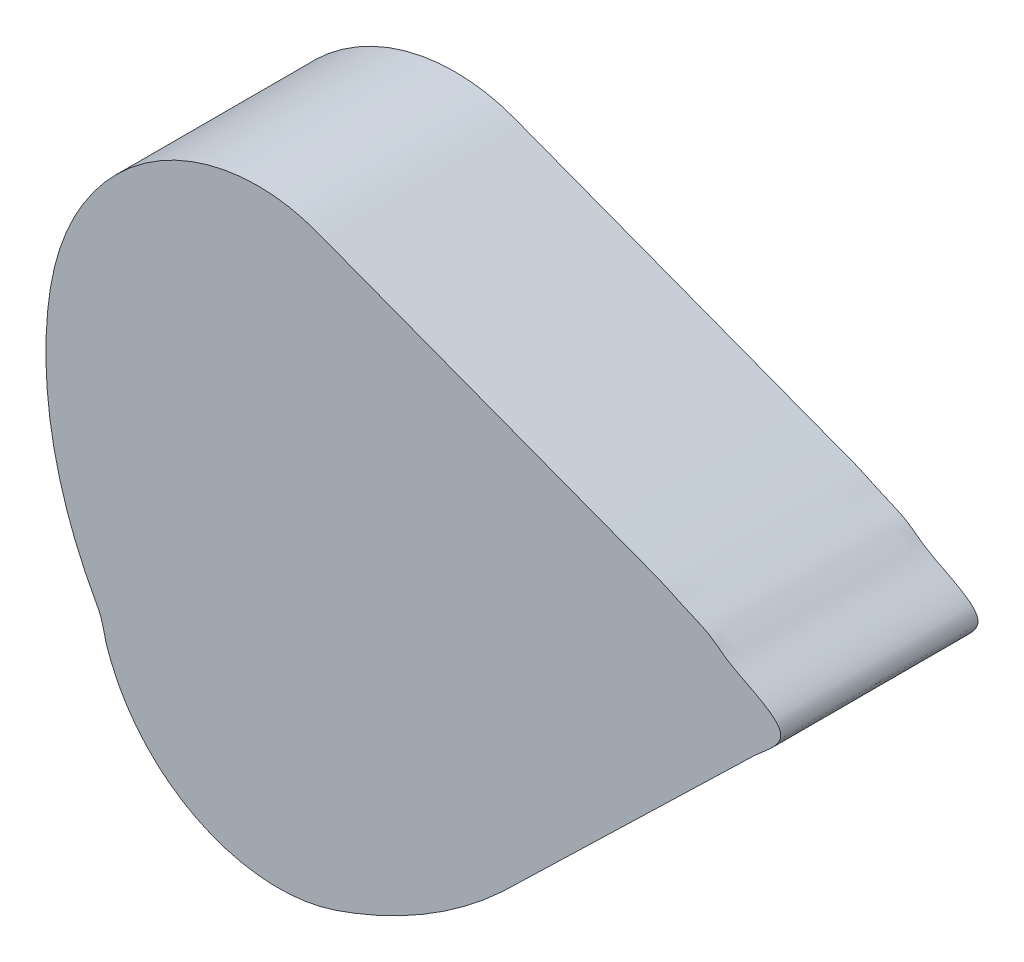
ISO-10303-21;
HEADER;
FILE_DESCRIPTION(('STEP AP214'),'2;1');
FILE_NAME('part.step','',(''),(''),'','','');
FILE_SCHEMA(('AUTOMOTIVE_DESIGN { 1 0 10303 214 1 1 1 1 }'));
ENDSEC;
DATA;
#1=APPLICATION_CONTEXT('core data for automotive mechanical design processes');
#2=APPLICATION_PROTOCOL_DEFINITION('international standard','automotive_design',2000,#1);
#3=PRODUCT_CONTEXT('',#1,'mechanical');
#4=PRODUCT('Part','Part','',(#3));
#5=PRODUCT_RELATED_PRODUCT_CATEGORY('part','',(#4));
#6=PRODUCT_DEFINITION_FORMATION('','',#4);
#7=PRODUCT_DEFINITION_CONTEXT('part definition',#1,'design');
#8=PRODUCT_DEFINITION('design','',#6,#7);
#9=PRODUCT_DEFINITION_SHAPE('','',#8);
#10=(LENGTH_UNIT() NAMED_UNIT(*) SI_UNIT(.MILLI.,.METRE.));
#11=(NAMED_UNIT(*) PLANE_ANGLE_UNIT() SI_UNIT($,.RADIAN.));
#12=(NAMED_UNIT(*) SI_UNIT($,.STERADIAN.) SOLID_ANGLE_UNIT());
#13=UNCERTAINTY_MEASURE_WITH_UNIT(LENGTH_MEASURE(1.E-05),#10,'distance_accuracy_value','');
#14=(GEOMETRIC_REPRESENTATION_CONTEXT(3) GLOBAL_UNCERTAINTY_ASSIGNED_CONTEXT((#13)) GLOBAL_UNIT_ASSIGNED_CONTEXT((#10,
#11,#12)) REPRESENTATION_CONTEXT('',''));
#15=CARTESIAN_POINT('',(0.,0.,0.));
#16=DIRECTION('',(0.,0.,1.));
#17=DIRECTION('',(1.,0.,0.));
#18=AXIS2_PLACEMENT_3D('',#15,#16,#17);
#19=CARTESIAN_POINT('',(0.,0.,0.));
#20=DIRECTION('',(0.,0.,1.));
#21=DIRECTION('',(1.,0.,0.));
#22=AXIS2_PLACEMENT_3D('',#19,#20,#21);
#23=PLANE('',#22);
#24=CARTESIAN_POINT('',(20.5801750110576,-0.00328204251736177,0.));
#25=CARTESIAN_POINT('',(20.5432210278033,0.745787441561675,0.));
#26=CARTESIAN_POINT('',(18.0884165931868,1.58204031077184,0.));
#27=CARTESIAN_POINT('',(17.0490235674398,2.62433253720728,0.));
#28=CARTESIAN_POINT('',(15.5584231630787,3.18631263785193,0.));
#29=CARTESIAN_POINT('',(14.6373272824708,3.68214834428944,0.));
#30=CARTESIAN_POINT('',(13.5264716057107,4.05815693579284,0.));
#31=CARTESIAN_POINT('',(12.6297469650909,4.42086780757551,0.));
#32=CARTESIAN_POINT('',(11.7187052529987,4.75499298698346,0.));
#33=CARTESIAN_POINT('',(10.9728764558887,5.04338001029282,0.));
#34=CARTESIAN_POINT('',(10.2726632604116,5.30680738929997,0.));
#35=CARTESIAN_POINT('',(9.64302944263146,5.5466729274272,0.));
#36=CARTESIAN_POINT('',(9.01036024214479,5.78636949663341,0.));
#37=CARTESIAN_POINT('',(8.44195983504167,6.00215192653301,0.));
#38=CARTESIAN_POINT('',(7.87322965274491,6.21791656905218,0.));
#39=CARTESIAN_POINT('',(7.36776855091183,6.40971118403902,0.));
#40=CARTESIAN_POINT('',(6.86229431024997,6.60150517539096,0.));
#41=CARTESIAN_POINT('',(6.42000235896164,6.76932478466845,0.));
#42=CARTESIAN_POINT('',(5.97771243748391,6.93714453060248,0.));
#43=CARTESIAN_POINT('',(5.59860636994376,7.08099004160621,0.));
#44=CARTESIAN_POINT('',(5.2195002019355,7.22483552478239,0.));
#45=CARTESIAN_POINT('',(4.84039416628741,7.36868113271391,0.));
#46=CARTESIAN_POINT('',(4.46128806726155,7.5125265902365,0.));
#47=CARTESIAN_POINT('',(4.08218200594753,7.65637217593161,0.));
#48=CARTESIAN_POINT('',(3.7030759554447,7.80021778084274,0.));
#49=CARTESIAN_POINT('',(3.32396990827291,7.94406339271218,0.));
#50=CARTESIAN_POINT('',(2.9448637318401,8.08790866519107,0.));
#51=CARTESIAN_POINT('',(2.56575753017023,8.23175387111745,0.));
#52=CARTESIAN_POINT('',(2.18665148897109,8.3755995032912,0.));
#53=CARTESIAN_POINT('',(1.80754555162476,8.51944540245951,0.));
#54=CARTESIAN_POINT('',(1.36525509787961,8.68726509344066,0.));
#55=CARTESIAN_POINT('',(0.922964760049557,8.8550851953787,0.));
#56=CARTESIAN_POINT('',(0.480673959827173,9.02290385151657,0.));
#57=CARTESIAN_POINT('',(0.101568074698047,9.16674971662014,0.));
#58=CARTESIAN_POINT('',(-0.340719679909042,9.33457782257238,0.));
#59=CARTESIAN_POINT('',(-0.783019919741634,9.50237038032076,0.));
#60=CARTESIAN_POINT('',(-1.2884840114042,9.69418573122273,0.));
#61=CARTESIAN_POINT('',(-1.79389921010987,9.88618192135013,0.));
#62=CARTESIAN_POINT('',(-2.36295891179039,10.1007566531692,0.));
#63=CARTESIAN_POINT('',(-2.9300054170546,10.3210454671022,0.));
#64=CARTESIAN_POINT('',(-3.50568707883132,10.5179270360777,0.));
#65=CARTESIAN_POINT('',(-4.09637115440215,10.6656817846962,0.));
#66=CARTESIAN_POINT('',(-4.69553677338327,10.7719825969725,0.));
#67=CARTESIAN_POINT('',(-5.30088918235372,10.8351897120933,0.));
#68=CARTESIAN_POINT('',(-5.97666724111209,10.8591560086911,0.));
#69=CARTESIAN_POINT('',(-6.65251930755436,10.8299284089694,0.));
#70=CARTESIAN_POINT('',(-7.32386130118969,10.7492907926941,0.));
#71=CARTESIAN_POINT('',(-7.98866092927194,10.6258687800201,0.));
#72=CARTESIAN_POINT('',(-8.64288179013676,10.4541038706398,0.));
#73=CARTESIAN_POINT('',(-9.2829340395075,10.2362085717274,0.));
#74=CARTESIAN_POINT('',(-9.90880434802783,9.98046930312413,0.));
#75=CARTESIAN_POINT('',(-10.5157459919354,9.68199370619098,0.));
#76=CARTESIAN_POINT('',(-11.1593517405741,9.30944323059998,0.));
#77=CARTESIAN_POINT('',(-11.721272953892,8.93305532246315,0.));
#78=CARTESIAN_POINT('',(-12.3107672450469,8.47971429268614,0.));
#79=CARTESIAN_POINT('',(-12.8696599831614,7.98875413383713,0.));
#80=CARTESIAN_POINT('',(-13.4399662442063,7.41148468903687,0.));
#81=CARTESIAN_POINT('',(-13.9233530122783,6.8460934740872,0.));
#82=CARTESIAN_POINT('',(-14.3720095175392,6.25302488848693,0.));
#83=CARTESIAN_POINT('',(-14.7828819713823,5.63297660408893,0.));
#84=CARTESIAN_POINT('',(-15.151620904232,4.9869876617203,0.));
#85=CARTESIAN_POINT('',(-15.4808974762007,4.32022897942989,0.));
#86=CARTESIAN_POINT('',(-15.76993421821,3.63484949838071,0.));
#87=CARTESIAN_POINT('',(-16.0342651596858,2.86769363970953,0.));
#88=CARTESIAN_POINT('',(-16.2477861257555,2.08489815940562,0.));
#89=CARTESIAN_POINT('',(-16.3992193845646,1.35677063974971,0.));
#90=CARTESIAN_POINT('',(-16.5145342991322,0.622232647357063,0.));
#91=CARTESIAN_POINT('',(-16.5967849188988,-0.116833193313319,0.));
#92=CARTESIAN_POINT('',(-16.6486957999856,-0.926301538499234,0.));
#93=CARTESIAN_POINT('',(-16.6687458721007,-1.73718338789421,0.));
#94=CARTESIAN_POINT('',(-16.6574672035936,-2.54820875444065,0.));
#95=CARTESIAN_POINT('',(-16.6119619625332,-3.35810876012838,0.));
#96=CARTESIAN_POINT('',(-16.5330144736496,-4.16536436059548,0.));
#97=CARTESIAN_POINT('',(-16.4301218087268,-4.90177809924551,0.));
#98=CARTESIAN_POINT('',(-16.2889743062609,-5.70045019666604,0.));
#99=CARTESIAN_POINT('',(-16.115096100061,-6.49282788362567,0.));
#100=CARTESIAN_POINT('',(-15.8873397006077,-7.34155401316279,0.));
#101=CARTESIAN_POINT('',(-15.6454145109644,-8.11569877487956,0.));
#102=CARTESIAN_POINT('',(-15.3726435065524,-8.87973588220181,0.));
#103=CARTESIAN_POINT('',(-15.0428350723045,-9.69393878061304,0.));
#104=CARTESIAN_POINT('',(-14.6786394954939,-10.4942693319161,0.));
#105=CARTESIAN_POINT('',(-14.2783956824274,-11.2753164705285,0.));
#106=CARTESIAN_POINT('',(-13.8249135207805,-12.0347118872762,0.));
#107=CARTESIAN_POINT('',(-13.6782572924911,-12.9827026122089,0.));
#108=CARTESIAN_POINT('',(-13.3249205202373,-13.8627937497184,0.));
#109=CARTESIAN_POINT('',(-12.9240589615011,-14.719377802384,0.));
#110=CARTESIAN_POINT('',(-12.425884053107,-15.5270016992826,0.));
#111=CARTESIAN_POINT('',(-11.8057267923948,-16.3297767970575,0.));
#112=CARTESIAN_POINT('',(-11.0969376393513,-17.0575708358574,0.));
#113=CARTESIAN_POINT('',(-10.3669372138577,-17.6612189153436,0.));
#114=CARTESIAN_POINT('',(-9.57813513653411,-18.1859256619209,0.));
#115=CARTESIAN_POINT('',(-8.74289182668402,-18.6330365669047,0.));
#116=CARTESIAN_POINT('',(-7.86237836139711,-18.9838069692146,0.));
#117=CARTESIAN_POINT('',(-6.95171049949413,-19.2439058080089,0.));
#118=CARTESIAN_POINT('',(-6.01922601377515,-19.4123077668367,0.));
#119=CARTESIAN_POINT('',(-5.00617282093212,-19.4819122275373,0.));
#120=CARTESIAN_POINT('',(-4.05959682339888,-19.4396748381815,0.));
#121=CARTESIAN_POINT('',(-3.12185977601414,-19.3058417161345,0.));
#122=CARTESIAN_POINT('',(-2.20270733938702,-19.0752155005075,0.));
#123=CARTESIAN_POINT('',(-1.24891697253783,-18.729639353729,0.));
#124=CARTESIAN_POINT('',(-0.307418309501143,-18.3541515276089,0.));
#125=CARTESIAN_POINT('',(0.55409369245096,-17.9620480837261,0.));
#126=CARTESIAN_POINT('',(1.40109575544649,-17.540407668128,0.));
#127=CARTESIAN_POINT('',(2.17102780481673,-17.1166921427362,0.));
#128=CARTESIAN_POINT('',(2.92431270132783,-16.6644139903236,0.));
#129=CARTESIAN_POINT('',(3.60457191284185,-16.2226517625221,0.));
#130=CARTESIAN_POINT('',(4.2691604588457,-15.7577452408945,0.));
#131=CARTESIAN_POINT('',(4.91727360776664,-15.2700415714364,0.));
#132=CARTESIAN_POINT('',(5.54789456820283,-14.7600237895279,0.));
#133=CARTESIAN_POINT('',(6.11030894847323,-14.2736966517023,0.));
#134=CARTESIAN_POINT('',(6.65641628407267,-13.769252379311,0.));
#135=CARTESIAN_POINT('',(7.18918329459313,-13.250760062271,0.));
#136=CARTESIAN_POINT('',(7.72360254629262,-12.7340601135323,0.));
#137=CARTESIAN_POINT('',(8.20909538689137,-12.2639443330234,0.));
#138=CARTESIAN_POINT('',(8.69465678110993,-11.7939129676647,0.));
#139=CARTESIAN_POINT('',(9.18020823945638,-11.323866499035,0.));
#140=CARTESIAN_POINT('',(9.71431546890485,-10.8068180406398,0.));
#141=CARTESIAN_POINT('',(10.199868194012,-10.3367737080533,0.));
#142=CARTESIAN_POINT('',(10.6854200783522,-9.86673000768316,0.));
#143=CARTESIAN_POINT('',(11.1709741034588,-9.39668460905305,0.));
#144=CARTESIAN_POINT('',(11.6565204142111,-8.92664197051953,0.));
#145=CARTESIAN_POINT('',(12.1906424420479,-8.40958934384532,0.));
#146=CARTESIAN_POINT('',(12.724713316719,-7.89255101982752,0.));
#147=CARTESIAN_POINT('',(13.2589047850603,-7.37547845542352,0.));
#148=CARTESIAN_POINT('',(13.7928162172932,-6.85848515260557,0.));
#149=CARTESIAN_POINT('',(14.3274053705047,-6.34130047032142,0.));
#150=CARTESIAN_POINT('',(14.9090225433516,-5.77754250168159,0.));
#151=CARTESIAN_POINT('',(15.5424749449812,-5.16585456749525,0.));
#152=CARTESIAN_POINT('',(16.1690891756243,-4.55609343626297,0.));
#153=CARTESIAN_POINT('',(16.8579939113785,-3.89547856029956,0.));
#154=CARTESIAN_POINT('',(17.5187221845955,-3.24259062480781,0.));
#155=CARTESIAN_POINT('',(18.3363105599088,-2.48050570271787,0.));
#156=CARTESIAN_POINT('',(19.3169007111456,-1.4230566339728,0.));
#157=CARTESIAN_POINT('',(20.6062601757076,-0.532036972454518,0.));
#158=CARTESIAN_POINT('',(20.5801750110576,-0.00328204251736177,0.));
#159=B_SPLINE_CURVE_WITH_KNOTS('',3,(#24,#25,#26,#27,#28,#29,#30,#31,#32,#33,#34,#35,#36,#37,
#38,#39,#40,#41,#42,#43,#44,#45,#46,#47,#48,#49,#50,#51,#52,#53,#54,#55,#56,#57,#58,#59,#60,#61,
#62,#63,#64,#65,#66,#67,#68,#69,#70,#71,#72,#73,#74,#75,#76,#77,#78,#79,#80,#81,#82,#83,#84,#85,
#86,#87,#88,#89,#90,#91,#92,#93,#94,#95,#96,#97,#98,#99,#100,#101,#102,#103,#104,#105,#106,#107,
#108,#109,#110,#111,#112,#113,#114,#115,#116,#117,#118,#119,#120,#121,#122,#123,#124,#125,#126,
#127,#128,#129,#130,#131,#132,#133,#134,#135,#136,#137,#138,#139,#140,#141,#142,#143,#144,#145,
#146,#147,#148,#149,#150,#151,#152,#153,#154,#155,#156,#157,#158),.UNSPECIFIED.,.T.,.F.,(4,1,1,
1,1,1,1,1,1,1,1,1,1,1,1,1,1,1,1,1,1,1,1,1,1,1,1,1,1,1,1,1,1,1,1,1,1,1,1,1,1,1,1,1,1,1,1,1,1,1,1,
1,1,1,1,1,1,1,1,1,1,1,1,1,1,1,1,1,1,1,1,1,1,1,1,1,1,1,1,1,1,1,1,1,1,1,1,1,1,1,1,1,1,1,1,1,1,1,1,
1,1,1,1,1,1,1,1,1,1,1,1,1,1,1,1,1,1,1,1,1,1,1,1,1,1,1,1,1,1,1,1,1,4),(0.,0.0332031249999999,
0.0449218750000001,0.05859375,0.0703125,0.080078125,0.08984375,0.099609375,0.107421875,
0.11328125,0.12109375,0.126953125,0.132812500000085,0.138671875,0.14453125,0.148437500000001,
0.154296874999992,0.158203125000007,0.162109375000003,0.166015624999994,0.169921875000001,
0.173828125000002,0.177734374999999,0.181640625,0.185546875,0.189453125,0.193359375,0.197265625,
0.201171875,0.205078125,0.2109375,0.21484375,0.21875,0.22265625,0.228515625,0.232421875,
0.23828125,0.244140625000012,0.250000000000006,0.255859375,0.26171875,0.267578125,0.2734375,
0.279296875,0.287109374999996,0.29296875,0.298828125,0.306640625,0.3125,0.318359375,
0.326171874999998,0.332031250000089,0.33984375,0.345703125,0.353515625,0.361328125,
0.369140624999999,0.37499999999999,0.382812499999977,0.390625,0.396484375,0.404296875,
0.412109375,0.419921875,0.427734375,0.433593749999998,0.441406249999986,0.44921875,0.45703125,
0.46484375,0.47265625,0.48046875,0.48828125,0.494140625,0.50390625,0.51171875,0.519531250000006,
0.527343749999997,0.535156250000016,0.544921874999995,0.552734375,0.560546875,0.570312499999968,
0.580078124999974,0.587890625000004,0.59765624999998,0.607421875,0.6171875,0.626953125,
0.634765625,0.64453125,0.654296875,0.662109375,0.671875,0.681640625,0.69140625,
0.699218749999874,0.708984375,0.71875,0.728515625000002,0.73828125,0.74609375,0.755859375,
0.763671875,0.771484374999965,0.779296875,0.787109375,0.794921875,0.802734375,0.80859375,
0.81640625,0.82421875,0.830078125,0.8359375,0.84375,0.849609375,0.857421875,0.86328125,
0.869140625,0.876953125,0.8828125,0.890625,0.8984375,0.904296875,0.912109375,0.919921875,
0.927734375,0.9375,0.9453125,0.955078125,0.96484375,0.976562500000044,1.),.UNSPECIFIED.);
#160=CARTESIAN_POINT('',(20.5801750110576,-0.00328204251736177,0.));
#161=VERTEX_POINT('',#160);
#162=EDGE_CURVE('E52',#161,#161,#159,.T.);
#163=ORIENTED_EDGE('',*,*,#162,.F.);
#164=EDGE_LOOP('',(#163));
#165=FACE_BOUND('',#164,.T.);
#166=ADVANCED_FACE('F44',(#165),#23,.F.);
#167=CARTESIAN_POINT('',(0.,0.,10.));
#168=DIRECTION('',(0.,0.,1.));
#169=DIRECTION('',(1.,0.,0.));
#170=AXIS2_PLACEMENT_3D('',#167,#168,#169);
#171=PLANE('',#170);
#172=CARTESIAN_POINT('',(20.5801750110576,-0.00328204251736177,10.));
#173=CARTESIAN_POINT('',(20.5432210278033,0.745787441561675,10.));
#174=CARTESIAN_POINT('',(18.0884165931868,1.58204031077184,10.));
#175=CARTESIAN_POINT('',(17.0490235674398,2.62433253720728,10.));
#176=CARTESIAN_POINT('',(15.5584231630787,3.18631263785193,10.));
#177=CARTESIAN_POINT('',(14.6373272824708,3.68214834428944,10.));
#178=CARTESIAN_POINT('',(13.5264716057107,4.05815693579284,10.));
#179=CARTESIAN_POINT('',(12.6297469650909,4.42086780757551,10.));
#180=CARTESIAN_POINT('',(11.7187052529987,4.75499298698346,10.));
#181=CARTESIAN_POINT('',(10.9728764558887,5.04338001029282,10.));
#182=CARTESIAN_POINT('',(10.2726632604116,5.30680738929997,10.));
#183=CARTESIAN_POINT('',(9.64302944263146,5.5466729274272,10.));
#184=CARTESIAN_POINT('',(9.01036024214479,5.78636949663341,10.));
#185=CARTESIAN_POINT('',(8.44195983504167,6.00215192653301,10.));
#186=CARTESIAN_POINT('',(7.87322965274491,6.21791656905218,10.));
#187=CARTESIAN_POINT('',(7.36776855091183,6.40971118403902,10.));
#188=CARTESIAN_POINT('',(6.86229431024997,6.60150517539096,10.));
#189=CARTESIAN_POINT('',(6.42000235896164,6.76932478466845,10.));
#190=CARTESIAN_POINT('',(5.97771243748391,6.93714453060248,10.));
#191=CARTESIAN_POINT('',(5.59860636994376,7.08099004160621,10.));
#192=CARTESIAN_POINT('',(5.2195002019355,7.22483552478239,10.));
#193=CARTESIAN_POINT('',(4.84039416628741,7.36868113271391,10.));
#194=CARTESIAN_POINT('',(4.46128806726155,7.5125265902365,10.));
#195=CARTESIAN_POINT('',(4.08218200594753,7.65637217593161,10.));
#196=CARTESIAN_POINT('',(3.7030759554447,7.80021778084274,10.));
#197=CARTESIAN_POINT('',(3.32396990827291,7.94406339271218,10.));
#198=CARTESIAN_POINT('',(2.9448637318401,8.08790866519107,10.));
#199=CARTESIAN_POINT('',(2.56575753017023,8.23175387111745,10.));
#200=CARTESIAN_POINT('',(2.18665148897109,8.3755995032912,10.));
#201=CARTESIAN_POINT('',(1.80754555162476,8.51944540245951,10.));
#202=CARTESIAN_POINT('',(1.36525509787961,8.68726509344066,10.));
#203=CARTESIAN_POINT('',(0.922964760049557,8.8550851953787,10.));
#204=CARTESIAN_POINT('',(0.480673959827173,9.02290385151657,10.));
#205=CARTESIAN_POINT('',(0.101568074698047,9.16674971662014,10.));
#206=CARTESIAN_POINT('',(-0.340719679909042,9.33457782257238,10.));
#207=CARTESIAN_POINT('',(-0.783019919741634,9.50237038032076,10.));
#208=CARTESIAN_POINT('',(-1.2884840114042,9.69418573122273,10.));
#209=CARTESIAN_POINT('',(-1.79389921010987,9.88618192135013,10.));
#210=CARTESIAN_POINT('',(-2.36295891179039,10.1007566531692,10.));
#211=CARTESIAN_POINT('',(-2.9300054170546,10.3210454671022,10.));
#212=CARTESIAN_POINT('',(-3.50568707883132,10.5179270360777,10.));
#213=CARTESIAN_POINT('',(-4.09637115440215,10.6656817846962,10.));
#214=CARTESIAN_POINT('',(-4.69553677338327,10.7719825969725,10.));
#215=CARTESIAN_POINT('',(-5.30088918235372,10.8351897120933,10.));
#216=CARTESIAN_POINT('',(-5.97666724111209,10.8591560086911,10.));
#217=CARTESIAN_POINT('',(-6.65251930755436,10.8299284089694,10.));
#218=CARTESIAN_POINT('',(-7.32386130118969,10.7492907926941,10.));
#219=CARTESIAN_POINT('',(-7.98866092927194,10.6258687800201,10.));
#220=CARTESIAN_POINT('',(-8.64288179013676,10.4541038706398,10.));
#221=CARTESIAN_POINT('',(-9.2829340395075,10.2362085717274,10.));
#222=CARTESIAN_POINT('',(-9.90880434802783,9.98046930312413,10.));
#223=CARTESIAN_POINT('',(-10.5157459919354,9.68199370619098,10.));
#224=CARTESIAN_POINT('',(-11.1593517405741,9.30944323059998,10.));
#225=CARTESIAN_POINT('',(-11.721272953892,8.93305532246315,10.));
#226=CARTESIAN_POINT('',(-12.3107672450469,8.47971429268614,10.));
#227=CARTESIAN_POINT('',(-12.8696599831614,7.98875413383713,10.));
#228=CARTESIAN_POINT('',(-13.4399662442063,7.41148468903687,10.));
#229=CARTESIAN_POINT('',(-13.9233530122783,6.8460934740872,10.));
#230=CARTESIAN_POINT('',(-14.3720095175392,6.25302488848693,10.));
#231=CARTESIAN_POINT('',(-14.7828819713823,5.63297660408893,10.));
#232=CARTESIAN_POINT('',(-15.151620904232,4.9869876617203,10.));
#233=CARTESIAN_POINT('',(-15.4808974762007,4.32022897942989,10.));
#234=CARTESIAN_POINT('',(-15.76993421821,3.63484949838071,10.));
#235=CARTESIAN_POINT('',(-16.0342651596858,2.86769363970953,10.));
#236=CARTESIAN_POINT('',(-16.2477861257555,2.08489815940562,10.));
#237=CARTESIAN_POINT('',(-16.3992193845646,1.35677063974971,10.));
#238=CARTESIAN_POINT('',(-16.5145342991322,0.622232647357063,10.));
#239=CARTESIAN_POINT('',(-16.5967849188988,-0.116833193313319,10.));
#240=CARTESIAN_POINT('',(-16.6486957999856,-0.926301538499234,10.));
#241=CARTESIAN_POINT('',(-16.6687458721007,-1.73718338789421,10.));
#242=CARTESIAN_POINT('',(-16.6574672035936,-2.54820875444065,10.));
#243=CARTESIAN_POINT('',(-16.6119619625332,-3.35810876012838,10.));
#244=CARTESIAN_POINT('',(-16.5330144736496,-4.16536436059548,10.));
#245=CARTESIAN_POINT('',(-16.4301218087268,-4.90177809924551,10.));
#246=CARTESIAN_POINT('',(-16.2889743062609,-5.70045019666604,10.));
#247=CARTESIAN_POINT('',(-16.115096100061,-6.49282788362567,10.));
#248=CARTESIAN_POINT('',(-15.8873397006077,-7.34155401316279,10.));
#249=CARTESIAN_POINT('',(-15.6454145109644,-8.11569877487956,10.));
#250=CARTESIAN_POINT('',(-15.3726435065524,-8.87973588220181,10.));
#251=CARTESIAN_POINT('',(-15.0428350723045,-9.69393878061304,10.));
#252=CARTESIAN_POINT('',(-14.6786394954939,-10.4942693319161,10.));
#253=CARTESIAN_POINT('',(-14.2783956824274,-11.2753164705285,10.));
#254=CARTESIAN_POINT('',(-13.8249135207805,-12.0347118872762,10.));
#255=CARTESIAN_POINT('',(-13.6782572924911,-12.9827026122089,10.));
#256=CARTESIAN_POINT('',(-13.3249205202373,-13.8627937497184,10.));
#257=CARTESIAN_POINT('',(-12.9240589615011,-14.719377802384,10.));
#258=CARTESIAN_POINT('',(-12.425884053107,-15.5270016992826,10.));
#259=CARTESIAN_POINT('',(-11.8057267923948,-16.3297767970575,10.));
#260=CARTESIAN_POINT('',(-11.0969376393513,-17.0575708358574,10.));
#261=CARTESIAN_POINT('',(-10.3669372138577,-17.6612189153436,10.));
#262=CARTESIAN_POINT('',(-9.57813513653411,-18.1859256619209,10.));
#263=CARTESIAN_POINT('',(-8.74289182668402,-18.6330365669047,10.));
#264=CARTESIAN_POINT('',(-7.86237836139711,-18.9838069692146,10.));
#265=CARTESIAN_POINT('',(-6.95171049949413,-19.2439058080089,10.));
#266=CARTESIAN_POINT('',(-6.01922601377515,-19.4123077668367,10.));
#267=CARTESIAN_POINT('',(-5.00617282093212,-19.4819122275373,10.));
#268=CARTESIAN_POINT('',(-4.05959682339888,-19.4396748381815,10.));
#269=CARTESIAN_POINT('',(-3.12185977601414,-19.3058417161345,10.));
#270=CARTESIAN_POINT('',(-2.20270733938702,-19.0752155005075,10.));
#271=CARTESIAN_POINT('',(-1.24891697253783,-18.729639353729,10.));
#272=CARTESIAN_POINT('',(-0.307418309501143,-18.3541515276089,10.));
#273=CARTESIAN_POINT('',(0.55409369245096,-17.9620480837261,10.));
#274=CARTESIAN_POINT('',(1.40109575544649,-17.540407668128,10.));
#275=CARTESIAN_POINT('',(2.17102780481673,-17.1166921427362,10.));
#276=CARTESIAN_POINT('',(2.92431270132783,-16.6644139903236,10.));
#277=CARTESIAN_POINT('',(3.60457191284185,-16.2226517625221,10.));
#278=CARTESIAN_POINT('',(4.2691604588457,-15.7577452408945,10.));
#279=CARTESIAN_POINT('',(4.91727360776664,-15.2700415714364,10.));
#280=CARTESIAN_POINT('',(5.54789456820283,-14.7600237895279,10.));
#281=CARTESIAN_POINT('',(6.11030894847323,-14.2736966517023,10.));
#282=CARTESIAN_POINT('',(6.65641628407267,-13.769252379311,10.));
#283=CARTESIAN_POINT('',(7.18918329459313,-13.250760062271,10.));
#284=CARTESIAN_POINT('',(7.72360254629262,-12.7340601135323,10.));
#285=CARTESIAN_POINT('',(8.20909538689137,-12.2639443330234,10.));
#286=CARTESIAN_POINT('',(8.69465678110993,-11.7939129676647,10.));
#287=CARTESIAN_POINT('',(9.18020823945638,-11.323866499035,10.));
#288=CARTESIAN_POINT('',(9.71431546890485,-10.8068180406398,10.));
#289=CARTESIAN_POINT('',(10.199868194012,-10.3367737080533,10.));
#290=CARTESIAN_POINT('',(10.6854200783522,-9.86673000768316,10.));
#291=CARTESIAN_POINT('',(11.1709741034588,-9.39668460905305,10.));
#292=CARTESIAN_POINT('',(11.6565204142111,-8.92664197051953,10.));
#293=CARTESIAN_POINT('',(12.1906424420479,-8.40958934384532,10.));
#294=CARTESIAN_POINT('',(12.724713316719,-7.89255101982752,10.));
#295=CARTESIAN_POINT('',(13.2589047850603,-7.37547845542352,10.));
#296=CARTESIAN_POINT('',(13.7928162172932,-6.85848515260557,10.));
#297=CARTESIAN_POINT('',(14.3274053705047,-6.34130047032142,10.));
#298=CARTESIAN_POINT('',(14.9090225433516,-5.77754250168159,10.));
#299=CARTESIAN_POINT('',(15.5424749449812,-5.16585456749525,10.));
#300=CARTESIAN_POINT('',(16.1690891756243,-4.55609343626297,10.));
#301=CARTESIAN_POINT('',(16.8579939113785,-3.89547856029956,10.));
#302=CARTESIAN_POINT('',(17.5187221845955,-3.24259062480781,10.));
#303=CARTESIAN_POINT('',(18.3363105599088,-2.48050570271787,10.));
#304=CARTESIAN_POINT('',(19.3169007111456,-1.4230566339728,10.));
#305=CARTESIAN_POINT('',(20.6062601757076,-0.532036972454518,10.));
#306=CARTESIAN_POINT('',(20.5801750110576,-0.00328204251736177,10.));
#307=B_SPLINE_CURVE_WITH_KNOTS('',3,(#172,#173,#174,#175,#176,#177,#178,#179,#180,#181,#182,
#183,#184,#185,#186,#187,#188,#189,#190,#191,#192,#193,#194,#195,#196,#197,#198,#199,#200,#201,
#202,#203,#204,#205,#206,#207,#208,#209,#210,#211,#212,#213,#214,#215,#216,#217,#218,#219,#220,
#221,#222,#223,#224,#225,#226,#227,#228,#229,#230,#231,#232,#233,#234,#235,#236,#237,#238,#239,
#240,#241,#242,#243,#244,#245,#246,#247,#248,#249,#250,#251,#252,#253,#254,#255,#256,#257,#258,
#259,#260,#261,#262,#263,#264,#265,#266,#267,#268,#269,#270,#271,#272,#273,#274,#275,#276,#277,
#278,#279,#280,#281,#282,#283,#284,#285,#286,#287,#288,#289,#290,#291,#292,#293,#294,#295,#296,
#297,#298,#299,#300,#301,#302,#303,#304,#305,#306),.UNSPECIFIED.,.T.,.F.,(4,1,1,1,1,1,1,1,1,1,1,
1,1,1,1,1,1,1,1,1,1,1,1,1,1,1,1,1,1,1,1,1,1,1,1,1,1,1,1,1,1,1,1,1,1,1,1,1,1,1,1,1,1,1,1,1,1,1,1,
1,1,1,1,1,1,1,1,1,1,1,1,1,1,1,1,1,1,1,1,1,1,1,1,1,1,1,1,1,1,1,1,1,1,1,1,1,1,1,1,1,1,1,1,1,1,1,1,
1,1,1,1,1,1,1,1,1,1,1,1,1,1,1,1,1,1,1,1,1,1,1,1,1,4),(0.,0.0332031249999999,0.0449218750000001,
0.05859375,0.0703125,0.080078125,0.08984375,0.099609375,0.107421875,0.11328125,0.12109375,
0.126953125,0.132812500000085,0.138671875,0.14453125,0.148437500000001,0.154296874999992,
0.158203125000007,0.162109375000003,0.166015624999994,0.169921875000001,0.173828125000002,
0.177734374999999,0.181640625,0.185546875,0.189453125,0.193359375,0.197265625,0.201171875,
0.205078125,0.2109375,0.21484375,0.21875,0.22265625,0.228515625,0.232421875,0.23828125,
0.244140625000012,0.250000000000006,0.255859375,0.26171875,0.267578125,0.2734375,0.279296875,
0.287109374999996,0.29296875,0.298828125,0.306640625,0.3125,0.318359375,0.326171874999998,
0.332031250000089,0.33984375,0.345703125,0.353515625,0.361328125,0.369140624999999,
0.37499999999999,0.382812499999977,0.390625,0.396484375,0.404296875,0.412109375,0.419921875,
0.427734375,0.433593749999998,0.441406249999986,0.44921875,0.45703125,0.46484375,0.47265625,
0.48046875,0.48828125,0.494140625,0.50390625,0.51171875,0.519531250000006,0.527343749999997,
0.535156250000016,0.544921874999995,0.552734375,0.560546875,0.570312499999968,0.580078124999974,
0.587890625000004,0.59765624999998,0.607421875,0.6171875,0.626953125,0.634765625,0.64453125,
0.654296875,0.662109375,0.671875,0.681640625,0.69140625,0.699218749999874,0.708984375,0.71875,
0.728515625000002,0.73828125,0.74609375,0.755859375,0.763671875,0.771484374999965,0.779296875,
0.787109375,0.794921875,0.802734375,0.80859375,0.81640625,0.82421875,0.830078125,0.8359375,
0.84375,0.849609375,0.857421875,0.86328125,0.869140625,0.876953125,0.8828125,0.890625,0.8984375,
0.904296875,0.912109375,0.919921875,0.927734375,0.9375,0.9453125,0.955078125,0.96484375,
0.976562500000044,1.),.UNSPECIFIED.);
#308=CARTESIAN_POINT('',(20.5801750110576,-0.00328204251736177,10.));
#309=VERTEX_POINT('',#308);
#310=EDGE_CURVE('E11',#309,#309,#307,.T.);
#311=ORIENTED_EDGE('',*,*,#310,.T.);
#312=EDGE_LOOP('',(#311));
#313=FACE_BOUND('',#312,.T.);
#314=ADVANCED_FACE('F67',(#313),#171,.T.);
#315=DIRECTION('',(0.,0.,1.));
#316=VECTOR('',#315,1.);
#317=SURFACE_OF_LINEAR_EXTRUSION('',#159,#316);
#318=ORIENTED_EDGE('',*,*,#162,.T.);
#319=EDGE_LOOP('',(#318));
#320=FACE_BOUND('',#319,.T.);
#321=ORIENTED_EDGE('',*,*,#310,.F.);
#322=EDGE_LOOP('',(#321));
#323=FACE_BOUND('',#322,.T.);
#324=ADVANCED_FACE('F65',(#320,#323),#317,.T.);
#325=CLOSED_SHELL('',(#166,#314,#324));
#326=MANIFOLD_SOLID_BREP('B2',#325);
#327=ADVANCED_BREP_SHAPE_REPRESENTATION('',(#18,#326),#14);
#328=SHAPE_DEFINITION_REPRESENTATION(#9,#327);
ENDSEC;
END-ISO-10303-21;
